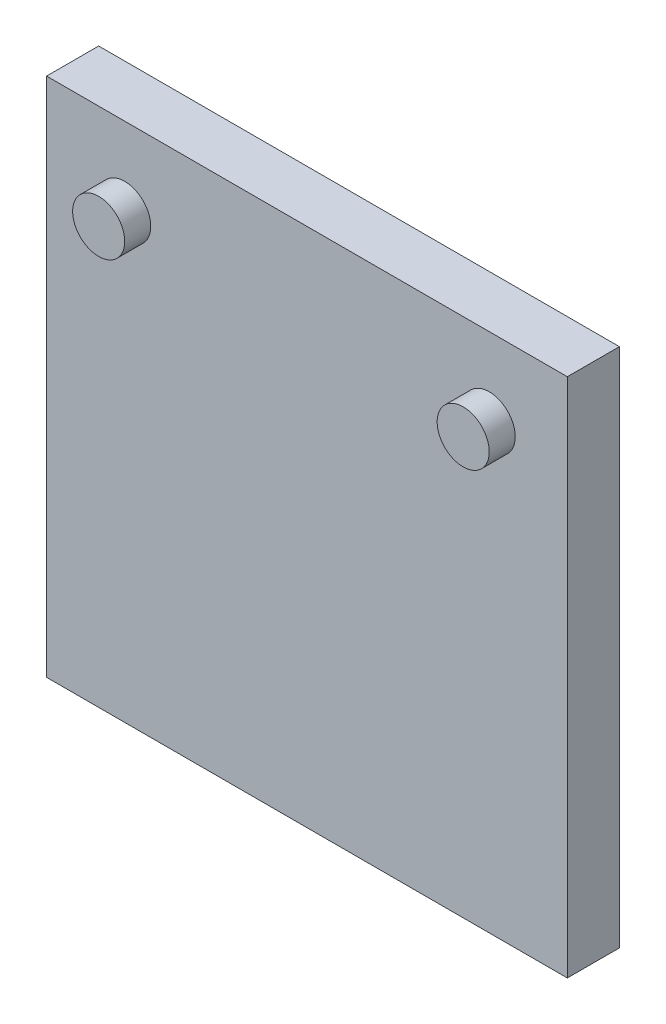
ISO-10303-21;
HEADER;
FILE_DESCRIPTION(('STEP AP214'),'2;1');
FILE_NAME('part.step','',(''),(''),'','','');
FILE_SCHEMA(('AUTOMOTIVE_DESIGN { 1 0 10303 214 1 1 1 1 }'));
ENDSEC;
DATA;
#1=APPLICATION_CONTEXT('core data for automotive mechanical design processes');
#2=APPLICATION_PROTOCOL_DEFINITION('international standard','automotive_design',2000,#1);
#3=PRODUCT_CONTEXT('',#1,'mechanical');
#4=PRODUCT('Part','Part','',(#3));
#5=PRODUCT_RELATED_PRODUCT_CATEGORY('part','',(#4));
#6=PRODUCT_DEFINITION_FORMATION('','',#4);
#7=PRODUCT_DEFINITION_CONTEXT('part definition',#1,'design');
#8=PRODUCT_DEFINITION('design','',#6,#7);
#9=PRODUCT_DEFINITION_SHAPE('','',#8);
#10=(LENGTH_UNIT() NAMED_UNIT(*) SI_UNIT(.MILLI.,.METRE.));
#11=(NAMED_UNIT(*) PLANE_ANGLE_UNIT() SI_UNIT($,.RADIAN.));
#12=(NAMED_UNIT(*) SI_UNIT($,.STERADIAN.) SOLID_ANGLE_UNIT());
#13=UNCERTAINTY_MEASURE_WITH_UNIT(LENGTH_MEASURE(1.E-05),#10,'distance_accuracy_value','');
#14=(GEOMETRIC_REPRESENTATION_CONTEXT(3) GLOBAL_UNCERTAINTY_ASSIGNED_CONTEXT((#13)) GLOBAL_UNIT_ASSIGNED_CONTEXT((#10,
#11,#12)) REPRESENTATION_CONTEXT('',''));
#15=CARTESIAN_POINT('',(0.,0.,0.));
#16=DIRECTION('',(0.,0.,1.));
#17=DIRECTION('',(1.,0.,0.));
#18=AXIS2_PLACEMENT_3D('',#15,#16,#17);
#19=CARTESIAN_POINT('',(0.,0.,9.99999999999999));
#20=DIRECTION('',(0.,0.,1.));
#21=DIRECTION('',(1.,0.,0.));
#22=AXIS2_PLACEMENT_3D('',#19,#20,#21);
#23=PLANE('',#22);
#24=CARTESIAN_POINT('',(-85.,85.0000000000001,9.99999999999999));
#25=DIRECTION('',(0.,0.,1.));
#26=DIRECTION('',(1.,0.,0.));
#27=AXIS2_PLACEMENT_3D('',#24,#25,#26);
#28=CIRCLE('',#27,5.00000000000001);
#29=CARTESIAN_POINT('',(-80.,85.0000000000001,9.99999999999999));
#30=VERTEX_POINT('',#29);
#31=EDGE_CURVE('E124',#30,#30,#28,.T.);
#32=ORIENTED_EDGE('',*,*,#31,.F.);
#33=EDGE_LOOP('',(#32));
#34=FACE_BOUND('',#33,.T.);
#35=DIRECTION('',(0.,1.,0.));
#36=VECTOR('',#35,1.);
#37=CARTESIAN_POINT('',(0.,0.,9.99999999999999));
#38=LINE('',#37,#36);
#39=CARTESIAN_POINT('',(0.,0.,9.99999999999999));
#40=VERTEX_POINT('',#39);
#41=CARTESIAN_POINT('',(0.,100.,9.99999999999999));
#42=VERTEX_POINT('',#41);
#43=EDGE_CURVE('E98',#40,#42,#38,.T.);
#44=ORIENTED_EDGE('',*,*,#43,.T.);
#45=DIRECTION('',(-1.,0.,0.));
#46=VECTOR('',#45,1.);
#47=CARTESIAN_POINT('',(0.,100.,9.99999999999999));
#48=LINE('',#47,#46);
#49=CARTESIAN_POINT('',(-100.,100.,9.99999999999999));
#50=VERTEX_POINT('',#49);
#51=EDGE_CURVE('E93',#42,#50,#48,.T.);
#52=ORIENTED_EDGE('',*,*,#51,.T.);
#53=DIRECTION('',(0.,-1.,0.));
#54=VECTOR('',#53,1.);
#55=CARTESIAN_POINT('',(-100.,0.,9.99999999999999));
#56=LINE('',#55,#54);
#57=CARTESIAN_POINT('',(-100.,0.,9.99999999999999));
#58=VERTEX_POINT('',#57);
#59=EDGE_CURVE('E96',#50,#58,#56,.T.);
#60=ORIENTED_EDGE('',*,*,#59,.T.);
#61=DIRECTION('',(1.,0.,0.));
#62=VECTOR('',#61,1.);
#63=CARTESIAN_POINT('',(0.,0.,9.99999999999999));
#64=LINE('',#63,#62);
#65=EDGE_CURVE('E63',#58,#40,#64,.T.);
#66=ORIENTED_EDGE('',*,*,#65,.T.);
#67=EDGE_LOOP('',(#44,#52,#60,#66));
#68=FACE_BOUND('',#67,.T.);
#69=CARTESIAN_POINT('',(-15.,85.0000000000001,9.99999999999999));
#70=DIRECTION('',(0.,0.,1.));
#71=DIRECTION('',(1.,0.,0.));
#72=AXIS2_PLACEMENT_3D('',#69,#70,#71);
#73=CIRCLE('',#72,5.);
#74=CARTESIAN_POINT('',(-10.,85.0000000000001,9.99999999999999));
#75=VERTEX_POINT('',#74);
#76=EDGE_CURVE('E130',#75,#75,#73,.T.);
#77=ORIENTED_EDGE('',*,*,#76,.F.);
#78=EDGE_LOOP('',(#77));
#79=FACE_BOUND('',#78,.T.);
#80=ADVANCED_FACE('F46',(#34,#68,#79),#23,.T.);
#81=CARTESIAN_POINT('',(0.,0.,9.99999999999999));
#82=DIRECTION('',(-1.,0.,0.));
#83=DIRECTION('',(0.,-1.,0.));
#84=AXIS2_PLACEMENT_3D('',#81,#82,#83);
#85=PLANE('',#84);
#86=DIRECTION('',(0.,1.,0.));
#87=VECTOR('',#86,1.);
#88=CARTESIAN_POINT('',(0.,0.,0.));
#89=LINE('',#88,#87);
#90=CARTESIAN_POINT('',(0.,0.,0.));
#91=VERTEX_POINT('',#90);
#92=CARTESIAN_POINT('',(0.,100.,0.));
#93=VERTEX_POINT('',#92);
#94=EDGE_CURVE('E110',#91,#93,#89,.T.);
#95=ORIENTED_EDGE('',*,*,#94,.T.);
#96=DIRECTION('',(0.,0.,-1.));
#97=VECTOR('',#96,1.);
#98=CARTESIAN_POINT('',(0.,100.,9.99999999999999));
#99=LINE('',#98,#97);
#100=EDGE_CURVE('E13',#42,#93,#99,.T.);
#101=ORIENTED_EDGE('',*,*,#100,.F.);
#102=ORIENTED_EDGE('',*,*,#43,.F.);
#103=DIRECTION('',(0.,0.,-1.));
#104=VECTOR('',#103,1.);
#105=CARTESIAN_POINT('',(0.,0.,9.99999999999999));
#106=LINE('',#105,#104);
#107=EDGE_CURVE('E106',#40,#91,#106,.T.);
#108=ORIENTED_EDGE('',*,*,#107,.T.);
#109=EDGE_LOOP('',(#95,#101,#102,#108));
#110=FACE_BOUND('',#109,.T.);
#111=ADVANCED_FACE('F48',(#110),#85,.F.);
#112=CARTESIAN_POINT('',(0.,100.,9.99999999999999));
#113=DIRECTION('',(0.,-1.,0.));
#114=DIRECTION('',(1.,0.,0.));
#115=AXIS2_PLACEMENT_3D('',#112,#113,#114);
#116=PLANE('',#115);
#117=DIRECTION('',(-1.,0.,0.));
#118=VECTOR('',#117,1.);
#119=CARTESIAN_POINT('',(0.,100.,0.));
#120=LINE('',#119,#118);
#121=CARTESIAN_POINT('',(-100.,100.,0.));
#122=VERTEX_POINT('',#121);
#123=EDGE_CURVE('E102',#93,#122,#120,.T.);
#124=ORIENTED_EDGE('',*,*,#123,.T.);
#125=DIRECTION('',(0.,0.,-1.));
#126=VECTOR('',#125,1.);
#127=CARTESIAN_POINT('',(-100.,100.,9.99999999999999));
#128=LINE('',#127,#126);
#129=EDGE_CURVE('E55',#50,#122,#128,.T.);
#130=ORIENTED_EDGE('',*,*,#129,.F.);
#131=ORIENTED_EDGE('',*,*,#51,.F.);
#132=ORIENTED_EDGE('',*,*,#100,.T.);
#133=EDGE_LOOP('',(#124,#130,#131,#132));
#134=FACE_BOUND('',#133,.T.);
#135=ADVANCED_FACE('F101',(#134),#116,.F.);
#136=CARTESIAN_POINT('',(-100.,0.,9.99999999999999));
#137=DIRECTION('',(1.,0.,0.));
#138=DIRECTION('',(0.,0.,-1.));
#139=AXIS2_PLACEMENT_3D('',#136,#137,#138);
#140=PLANE('',#139);
#141=DIRECTION('',(0.,-1.,0.));
#142=VECTOR('',#141,1.);
#143=CARTESIAN_POINT('',(-100.,0.,0.));
#144=LINE('',#143,#142);
#145=CARTESIAN_POINT('',(-100.,0.,0.));
#146=VERTEX_POINT('',#145);
#147=EDGE_CURVE('E80',#122,#146,#144,.T.);
#148=ORIENTED_EDGE('',*,*,#147,.T.);
#149=DIRECTION('',(0.,0.,-1.));
#150=VECTOR('',#149,1.);
#151=CARTESIAN_POINT('',(-100.,0.,9.99999999999999));
#152=LINE('',#151,#150);
#153=EDGE_CURVE('E103',#58,#146,#152,.T.);
#154=ORIENTED_EDGE('',*,*,#153,.F.);
#155=ORIENTED_EDGE('',*,*,#59,.F.);
#156=ORIENTED_EDGE('',*,*,#129,.T.);
#157=EDGE_LOOP('',(#148,#154,#155,#156));
#158=FACE_BOUND('',#157,.T.);
#159=ADVANCED_FACE('F104',(#158),#140,.F.);
#160=CARTESIAN_POINT('',(0.,0.,9.99999999999999));
#161=DIRECTION('',(0.,1.,0.));
#162=DIRECTION('',(-1.,0.,0.));
#163=AXIS2_PLACEMENT_3D('',#160,#161,#162);
#164=PLANE('',#163);
#165=DIRECTION('',(1.,0.,0.));
#166=VECTOR('',#165,1.);
#167=CARTESIAN_POINT('',(0.,0.,0.));
#168=LINE('',#167,#166);
#169=EDGE_CURVE('E86',#146,#91,#168,.T.);
#170=ORIENTED_EDGE('',*,*,#169,.T.);
#171=ORIENTED_EDGE('',*,*,#107,.F.);
#172=ORIENTED_EDGE('',*,*,#65,.F.);
#173=ORIENTED_EDGE('',*,*,#153,.T.);
#174=EDGE_LOOP('',(#170,#171,#172,#173));
#175=FACE_BOUND('',#174,.T.);
#176=ADVANCED_FACE('F118',(#175),#164,.F.);
#177=CARTESIAN_POINT('',(0.,0.,0.));
#178=DIRECTION('',(0.,0.,1.));
#179=DIRECTION('',(1.,0.,0.));
#180=AXIS2_PLACEMENT_3D('',#177,#178,#179);
#181=PLANE('',#180);
#182=ORIENTED_EDGE('',*,*,#94,.F.);
#183=ORIENTED_EDGE('',*,*,#169,.F.);
#184=ORIENTED_EDGE('',*,*,#147,.F.);
#185=ORIENTED_EDGE('',*,*,#123,.F.);
#186=EDGE_LOOP('',(#182,#183,#184,#185));
#187=FACE_BOUND('',#186,.T.);
#188=ADVANCED_FACE('F121',(#187),#181,.F.);
#189=CARTESIAN_POINT('',(-85.,85.0000000000001,15.));
#190=DIRECTION('',(0.,0.,-1.));
#191=DIRECTION('',(-1.,0.,0.));
#192=AXIS2_PLACEMENT_3D('',#189,#190,#191);
#193=CYLINDRICAL_SURFACE('',#192,5.00000000000001);
#194=CARTESIAN_POINT('',(-85.,85.0000000000001,15.));
#195=DIRECTION('',(0.,0.,1.));
#196=DIRECTION('',(1.,0.,0.));
#197=AXIS2_PLACEMENT_3D('',#194,#195,#196);
#198=CIRCLE('',#197,5.00000000000001);
#199=CARTESIAN_POINT('',(-80.,85.0000000000001,15.));
#200=VERTEX_POINT('',#199);
#201=EDGE_CURVE('E113',#200,#200,#198,.T.);
#202=ORIENTED_EDGE('',*,*,#201,.F.);
#203=EDGE_LOOP('',(#202));
#204=FACE_BOUND('',#203,.T.);
#205=ORIENTED_EDGE('',*,*,#31,.T.);
#206=EDGE_LOOP('',(#205));
#207=FACE_BOUND('',#206,.T.);
#208=ADVANCED_FACE('F153',(#204,#207),#193,.T.);
#209=CARTESIAN_POINT('',(-85.,85.0000000000001,15.));
#210=DIRECTION('',(0.,0.,1.));
#211=DIRECTION('',(1.,0.,0.));
#212=AXIS2_PLACEMENT_3D('',#209,#210,#211);
#213=PLANE('',#212);
#214=ORIENTED_EDGE('',*,*,#201,.T.);
#215=EDGE_LOOP('',(#214));
#216=FACE_BOUND('',#215,.T.);
#217=ADVANCED_FACE('F141',(#216),#213,.T.);
#218=CARTESIAN_POINT('',(-15.,85.0000000000001,15.));
#219=DIRECTION('',(0.,0.,-1.));
#220=DIRECTION('',(-1.,0.,0.));
#221=AXIS2_PLACEMENT_3D('',#218,#219,#220);
#222=CYLINDRICAL_SURFACE('',#221,5.);
#223=CARTESIAN_POINT('',(-15.,85.0000000000001,15.));
#224=DIRECTION('',(0.,0.,1.));
#225=DIRECTION('',(1.,0.,0.));
#226=AXIS2_PLACEMENT_3D('',#223,#224,#225);
#227=CIRCLE('',#226,5.);
#228=CARTESIAN_POINT('',(-10.,85.0000000000001,15.));
#229=VERTEX_POINT('',#228);
#230=EDGE_CURVE('E127',#229,#229,#227,.T.);
#231=ORIENTED_EDGE('',*,*,#230,.F.);
#232=EDGE_LOOP('',(#231));
#233=FACE_BOUND('',#232,.T.);
#234=ORIENTED_EDGE('',*,*,#76,.T.);
#235=EDGE_LOOP('',(#234));
#236=FACE_BOUND('',#235,.T.);
#237=ADVANCED_FACE('F138',(#233,#236),#222,.T.);
#238=CARTESIAN_POINT('',(-15.,85.0000000000001,15.));
#239=DIRECTION('',(0.,0.,1.));
#240=DIRECTION('',(1.,0.,0.));
#241=AXIS2_PLACEMENT_3D('',#238,#239,#240);
#242=PLANE('',#241);
#243=ORIENTED_EDGE('',*,*,#230,.T.);
#244=EDGE_LOOP('',(#243));
#245=FACE_BOUND('',#244,.T.);
#246=ADVANCED_FACE('F136',(#245),#242,.T.);
#247=CLOSED_SHELL('',(#80,#111,#135,#159,#176,#188,#208,#217,#237,#246));
#248=MANIFOLD_SOLID_BREP('B2',#247);
#249=ADVANCED_BREP_SHAPE_REPRESENTATION('',(#18,#248),#14);
#250=SHAPE_DEFINITION_REPRESENTATION(#9,#249);
ENDSEC;
END-ISO-10303-21;
